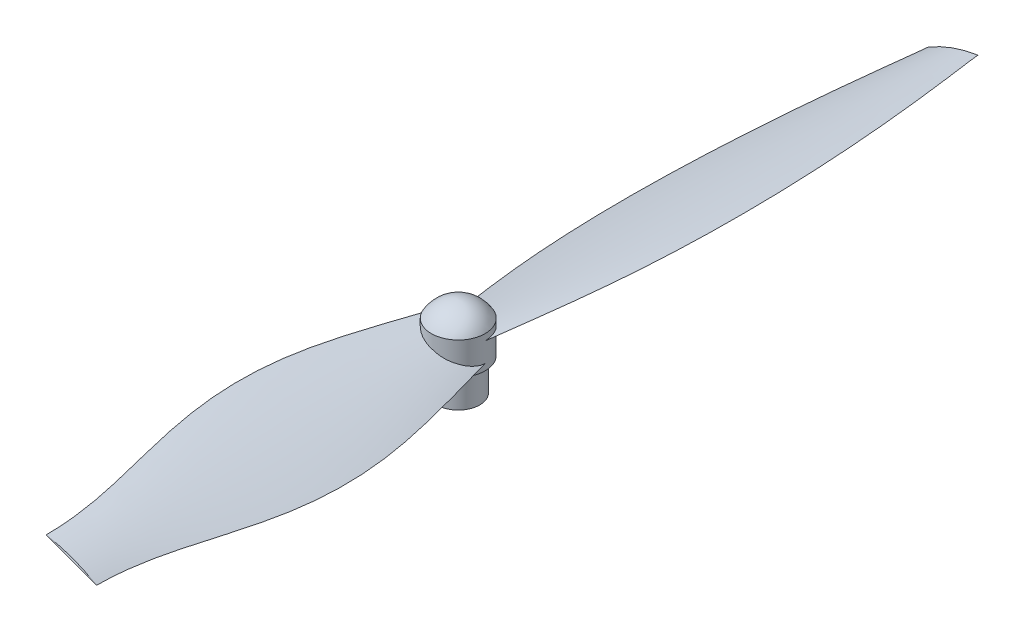
ISO-10303-21;
HEADER;
FILE_DESCRIPTION(('STEP AP214'),'2;1');
FILE_NAME('part.step','',(''),(''),'','','');
FILE_SCHEMA(('AUTOMOTIVE_DESIGN { 1 0 10303 214 1 1 1 1 }'));
ENDSEC;
DATA;
#1=APPLICATION_CONTEXT('core data for automotive mechanical design processes');
#2=APPLICATION_PROTOCOL_DEFINITION('international standard','automotive_design',2000,#1);
#3=PRODUCT_CONTEXT('',#1,'mechanical');
#4=PRODUCT('Part','Part','',(#3));
#5=PRODUCT_RELATED_PRODUCT_CATEGORY('part','',(#4));
#6=PRODUCT_DEFINITION_FORMATION('','',#4);
#7=PRODUCT_DEFINITION_CONTEXT('part definition',#1,'design');
#8=PRODUCT_DEFINITION('design','',#6,#7);
#9=PRODUCT_DEFINITION_SHAPE('','',#8);
#10=(LENGTH_UNIT() NAMED_UNIT(*) SI_UNIT(.MILLI.,.METRE.));
#11=(NAMED_UNIT(*) PLANE_ANGLE_UNIT() SI_UNIT($,.RADIAN.));
#12=(NAMED_UNIT(*) SI_UNIT($,.STERADIAN.) SOLID_ANGLE_UNIT());
#13=UNCERTAINTY_MEASURE_WITH_UNIT(LENGTH_MEASURE(1.E-05),#10,'distance_accuracy_value','');
#14=(GEOMETRIC_REPRESENTATION_CONTEXT(3) GLOBAL_UNCERTAINTY_ASSIGNED_CONTEXT((#13)) GLOBAL_UNIT_ASSIGNED_CONTEXT((#10,
#11,#12)) REPRESENTATION_CONTEXT('',''));
#15=CARTESIAN_POINT('',(0.,0.,0.));
#16=DIRECTION('',(0.,0.,1.));
#17=DIRECTION('',(1.,0.,0.));
#18=AXIS2_PLACEMENT_3D('',#15,#16,#17);
#19=CARTESIAN_POINT('',(-5.,7.18014882866901,0.));
#20=CARTESIAN_POINT('',(-5.,7.18014882866901,-0.681599091436951));
#21=CARTESIAN_POINT('',(-16.7309640210177,2.91042710577081,-44.6583309091122));
#22=CARTESIAN_POINT('',(-4.69846310392955,7.28989928337167,-89.5951543312805));
#23=CARTESIAN_POINT('',(-4.69846310392955,7.28989928337167,-92.));
#24=CARTESIAN_POINT('',(-1.96659598404994,9.09694074113013,0.));
#25=CARTESIAN_POINT('',(-1.96659598404994,9.09694074113013,-0.681599091436951));
#26=CARTESIAN_POINT('',(-5.83586544031535,7.71289175396942,-44.6583309091122));
#27=CARTESIAN_POINT('',(-1.82850177394058,9.05116134838689,-89.5951543312805));
#28=CARTESIAN_POINT('',(-1.82850177394058,9.05116134838689,-92.));
#29=CARTESIAN_POINT('',(1.44418761816929,10.3383644478612,0.));
#30=CARTESIAN_POINT('',(1.44418761816929,10.3383644478612,-0.68159909143695));
#31=CARTESIAN_POINT('',(5.29786952421744,11.7652398772682,-44.6583309091122));
#32=CARTESIAN_POINT('',(1.36782774232244,10.2145301512131,-89.5951543312805));
#33=CARTESIAN_POINT('',(1.36782774232244,10.2145301512131,-92.));
#34=CARTESIAN_POINT('',(5.,10.819851171331,0.));
#35=CARTESIAN_POINT('',(5.,10.819851171331,-0.68159909143695));
#36=CARTESIAN_POINT('',(16.7309640210177,15.0895728942291,-44.6583309091122));
#37=CARTESIAN_POINT('',(4.69846310392955,10.7101007166283,-89.5951543312805));
#38=CARTESIAN_POINT('',(4.69846310392955,10.7101007166283,-92.));
#39=B_SPLINE_SURFACE_WITH_KNOTS('',3,3,((#19,#20,#21,#22,#23),(#24,#25,#26,#27,#28),(#29,#30,
#31,#32,#33),(#34,#35,#36,#37,#38)),.UNSPECIFIED.,.F.,.F.,.F.,(4,4),(4,1,4),(0.,1.),(0.,
0.219119327033354,1.),.UNSPECIFIED.);
#40=CARTESIAN_POINT('',(-5.,7.18014882866901,0.));
#41=CARTESIAN_POINT('',(-1.96659598404994,9.09694074113013,0.));
#42=CARTESIAN_POINT('',(1.44418761816929,10.3383644478612,0.));
#43=CARTESIAN_POINT('',(5.,10.819851171331,0.));
#44=B_SPLINE_CURVE_WITH_KNOTS('',3,(#40,#41,#42,#43),.UNSPECIFIED.,.F.,.F.,(4,4),(0.,1.),.UNSPECIFIED.);
#45=CARTESIAN_POINT('',(-5.,7.18014882866901,0.));
#46=VERTEX_POINT('',#45);
#47=CARTESIAN_POINT('',(5.,10.819851171331,0.));
#48=VERTEX_POINT('',#47);
#49=EDGE_CURVE('E105',#46,#48,#44,.T.);
#50=CARTESIAN_POINT('',(5.,10.819851171331,0.));
#51=CARTESIAN_POINT('',(5.,10.819851171331,-0.68159909143695));
#52=CARTESIAN_POINT('',(16.7309640210177,15.0895728942291,-44.6583309091122));
#53=CARTESIAN_POINT('',(4.69846310392955,10.7101007166283,-89.5951543312805));
#54=CARTESIAN_POINT('',(4.69846310392955,10.7101007166283,-92.));
#55=B_SPLINE_CURVE_WITH_KNOTS('',3,(#50,#51,#52,#53,#54),.UNSPECIFIED.,.F.,.F.,(4,1,4),(0.,
0.219119327033354,1.),.UNSPECIFIED.);
#56=CARTESIAN_POINT('',(4.69846310392955,10.7101007166283,-92.));
#57=VERTEX_POINT('',#56);
#58=EDGE_CURVE('E104',#48,#57,#55,.T.);
#59=CARTESIAN_POINT('',(-4.69846310392955,7.28989928337167,-92.));
#60=CARTESIAN_POINT('',(-1.82850177394058,9.05116134838689,-92.));
#61=CARTESIAN_POINT('',(1.36782774232244,10.2145301512131,-92.));
#62=CARTESIAN_POINT('',(4.69846310392955,10.7101007166283,-92.));
#63=B_SPLINE_CURVE_WITH_KNOTS('',3,(#59,#60,#61,#62),.UNSPECIFIED.,.F.,.F.,(4,4),(0.,1.),.UNSPECIFIED.);
#64=CARTESIAN_POINT('',(-4.69846310392955,7.28989928337167,-92.));
#65=VERTEX_POINT('',#64);
#66=EDGE_CURVE('E91',#57,#65,#63,.F.);
#67=CARTESIAN_POINT('',(-5.,7.18014882866901,0.));
#68=CARTESIAN_POINT('',(-5.,7.18014882866901,-0.681599091436951));
#69=CARTESIAN_POINT('',(-16.7309640210177,2.91042710577081,-44.6583309091122));
#70=CARTESIAN_POINT('',(-4.69846310392955,7.28989928337167,-89.5951543312805));
#71=CARTESIAN_POINT('',(-4.69846310392955,7.28989928337167,-92.));
#72=B_SPLINE_CURVE_WITH_KNOTS('',3,(#67,#68,#69,#70,#71),.UNSPECIFIED.,.F.,.F.,(4,1,4),(0.,
0.219119327033354,1.),.UNSPECIFIED.);
#73=EDGE_CURVE('E103',#65,#46,#72,.F.);
#74=ORIENTED_EDGE('',*,*,#49,.T.);
#75=ORIENTED_EDGE('',*,*,#58,.T.);
#76=ORIENTED_EDGE('',*,*,#66,.T.);
#77=ORIENTED_EDGE('',*,*,#73,.T.);
#78=EDGE_LOOP('',(#74,#75,#76,#77));
#79=FACE_BOUND('',#78,.T.);
#80=ADVANCED_FACE('F76',(#79),#39,.T.);
#81=CARTESIAN_POINT('',(5.,10.819851171331,0.));
#82=DIRECTION('',(0.342020143325666,-0.939692620785909,0.));
#83=DIRECTION('',(-0.939692620785909,-0.342020143325666,0.));
#84=AXIS2_PLACEMENT_3D('',#81,#82,#83);
#85=PLANE('',#84);
#86=DIRECTION('',(-0.939692620785909,-0.342020143325666,0.));
#87=VECTOR('',#86,1.);
#88=CARTESIAN_POINT('',(0.,9.,0.));
#89=LINE('',#88,#87);
#90=EDGE_CURVE('E13',#48,#46,#89,.T.);
#91=ORIENTED_EDGE('',*,*,#90,.T.);
#92=ORIENTED_EDGE('',*,*,#73,.F.);
#93=DIRECTION('',(0.939692620785909,0.342020143325666,0.));
#94=VECTOR('',#93,1.);
#95=CARTESIAN_POINT('',(0.,9.,-92.));
#96=LINE('',#95,#94);
#97=EDGE_CURVE('E79',#65,#57,#96,.T.);
#98=ORIENTED_EDGE('',*,*,#97,.T.);
#99=ORIENTED_EDGE('',*,*,#58,.F.);
#100=EDGE_LOOP('',(#91,#92,#98,#99));
#101=FACE_BOUND('',#100,.T.);
#102=ADVANCED_FACE('F77',(#101),#85,.T.);
#103=OPEN_SHELL('',(#80,#102));
#104=SHELL_BASED_SURFACE_MODEL('B2',(#103));
#105=CARTESIAN_POINT('',(5.00000000000001,7.18014882866901,0.));
#106=CARTESIAN_POINT('',(5.00000000000001,7.18014882866901,0.681599091436951));
#107=CARTESIAN_POINT('',(14.9872215471169,3.5450974624965,38.1684985384249));
#108=CARTESIAN_POINT('',(4.69846310392955,7.28989928337168,54.5996346739401));
#109=CARTESIAN_POINT('',(4.69846310392955,7.28989928337168,72.));
#110=CARTESIAN_POINT('',(1.96659598404995,9.09694074113012,0.));
#111=CARTESIAN_POINT('',(1.96659598404995,9.09694074113012,0.68159909143695));
#112=CARTESIAN_POINT('',(5.26361434140243,7.92471716546496,38.1684985384249));
#113=CARTESIAN_POINT('',(1.82850177394058,9.05116134838689,54.5996346739401));
#114=CARTESIAN_POINT('',(1.82850177394058,9.05116134838689,72.));
#115=CARTESIAN_POINT('',(-1.44418761816929,10.3383644478612,0.));
#116=CARTESIAN_POINT('',(-1.44418761816929,10.3383644478612,0.68159909143695));
#117=CARTESIAN_POINT('',(-4.72334099990042,11.559671640645,38.1684985384249));
#118=CARTESIAN_POINT('',(-1.36782774232243,10.2145301512131,54.5996346739401));
#119=CARTESIAN_POINT('',(-1.36782774232243,10.2145301512131,72.));
#120=CARTESIAN_POINT('',(-5.,10.819851171331,0.));
#121=CARTESIAN_POINT('',(-5.,10.819851171331,0.68159909143695));
#122=CARTESIAN_POINT('',(-14.9872215471168,14.4549025375035,38.1684985384249));
#123=CARTESIAN_POINT('',(-4.69846310392954,10.7101007166283,54.5996346739401));
#124=CARTESIAN_POINT('',(-4.69846310392954,10.7101007166283,72.));
#125=B_SPLINE_SURFACE_WITH_KNOTS('',3,3,((#105,#106,#107,#108,#109),(#110,#111,#112,#113,#114),
(#115,#116,#117,#118,#119),(#120,#121,#122,#123,#124)),.UNSPECIFIED.,.F.,.F.,.F.,(4,4),(4,1,4),
(0.,1.),(0.,0.279628251466301,1.),.UNSPECIFIED.);
#126=CARTESIAN_POINT('',(5.00000000000001,7.18014882866901,0.));
#127=CARTESIAN_POINT('',(1.96659598404995,9.09694074113012,0.));
#128=CARTESIAN_POINT('',(-1.44418761816929,10.3383644478612,0.));
#129=CARTESIAN_POINT('',(-5.,10.819851171331,0.));
#130=B_SPLINE_CURVE_WITH_KNOTS('',3,(#126,#127,#128,#129),.UNSPECIFIED.,.F.,.F.,(4,4),(0.,1.),.UNSPECIFIED.);
#131=CARTESIAN_POINT('',(5.00000000000001,7.18014882866901,0.));
#132=VERTEX_POINT('',#131);
#133=CARTESIAN_POINT('',(-5.,10.819851171331,0.));
#134=VERTEX_POINT('',#133);
#135=EDGE_CURVE('E203',#132,#134,#130,.T.);
#136=CARTESIAN_POINT('',(-5.,10.819851171331,0.));
#137=CARTESIAN_POINT('',(-5.,10.819851171331,0.68159909143695));
#138=CARTESIAN_POINT('',(-14.9872215471168,14.4549025375035,38.1684985384249));
#139=CARTESIAN_POINT('',(-4.69846310392954,10.7101007166283,54.5996346739401));
#140=CARTESIAN_POINT('',(-4.69846310392954,10.7101007166283,72.));
#141=B_SPLINE_CURVE_WITH_KNOTS('',3,(#136,#137,#138,#139,#140),.UNSPECIFIED.,.F.,.F.,(4,1,4),
(0.,0.279628251466301,1.),.UNSPECIFIED.);
#142=CARTESIAN_POINT('',(-4.69846310392954,10.7101007166283,72.));
#143=VERTEX_POINT('',#142);
#144=EDGE_CURVE('E202',#134,#143,#141,.T.);
#145=CARTESIAN_POINT('',(4.69846310392955,7.28989928337168,72.));
#146=CARTESIAN_POINT('',(1.82850177394058,9.05116134838689,72.));
#147=CARTESIAN_POINT('',(-1.36782774232243,10.2145301512131,72.));
#148=CARTESIAN_POINT('',(-4.69846310392954,10.7101007166283,72.));
#149=B_SPLINE_CURVE_WITH_KNOTS('',3,(#145,#146,#147,#148),.UNSPECIFIED.,.F.,.F.,(4,4),(0.,1.),.UNSPECIFIED.);
#150=CARTESIAN_POINT('',(4.69846310392955,7.28989928337168,72.));
#151=VERTEX_POINT('',#150);
#152=EDGE_CURVE('E189',#143,#151,#149,.F.);
#153=CARTESIAN_POINT('',(5.00000000000001,7.18014882866901,0.));
#154=CARTESIAN_POINT('',(5.00000000000001,7.18014882866901,0.681599091436951));
#155=CARTESIAN_POINT('',(14.9872215471169,3.5450974624965,38.1684985384249));
#156=CARTESIAN_POINT('',(4.69846310392955,7.28989928337168,54.5996346739401));
#157=CARTESIAN_POINT('',(4.69846310392955,7.28989928337168,72.));
#158=B_SPLINE_CURVE_WITH_KNOTS('',3,(#153,#154,#155,#156,#157),.UNSPECIFIED.,.F.,.F.,(4,1,4),
(0.,0.279628251466301,1.),.UNSPECIFIED.);
#159=EDGE_CURVE('E201',#151,#132,#158,.F.);
#160=ORIENTED_EDGE('',*,*,#135,.T.);
#161=ORIENTED_EDGE('',*,*,#144,.T.);
#162=ORIENTED_EDGE('',*,*,#152,.T.);
#163=ORIENTED_EDGE('',*,*,#159,.T.);
#164=EDGE_LOOP('',(#160,#161,#162,#163));
#165=FACE_BOUND('',#164,.T.);
#166=ADVANCED_FACE('F174',(#165),#125,.T.);
#167=CARTESIAN_POINT('',(-5.,10.819851171331,0.));
#168=DIRECTION('',(-0.342020143325665,-0.93969262078591,0.));
#169=DIRECTION('',(0.93969262078591,-0.342020143325665,0.));
#170=AXIS2_PLACEMENT_3D('',#167,#168,#169);
#171=PLANE('',#170);
#172=DIRECTION('',(0.93969262078591,-0.342020143325665,0.));
#173=VECTOR('',#172,1.);
#174=CARTESIAN_POINT('',(0.,9.,0.));
#175=LINE('',#174,#173);
#176=EDGE_CURVE('E74',#134,#132,#175,.T.);
#177=ORIENTED_EDGE('',*,*,#176,.T.);
#178=ORIENTED_EDGE('',*,*,#159,.F.);
#179=DIRECTION('',(-0.93969262078591,0.342020143325665,0.));
#180=VECTOR('',#179,1.);
#181=CARTESIAN_POINT('',(0.,9.,72.));
#182=LINE('',#181,#180);
#183=EDGE_CURVE('E177',#151,#143,#182,.T.);
#184=ORIENTED_EDGE('',*,*,#183,.T.);
#185=ORIENTED_EDGE('',*,*,#144,.F.);
#186=EDGE_LOOP('',(#177,#178,#184,#185));
#187=FACE_BOUND('',#186,.T.);
#188=ADVANCED_FACE('F175',(#187),#171,.T.);
#189=OPEN_SHELL('',(#166,#188));
#190=SHELL_BASED_SURFACE_MODEL('B7',(#189));
#191=CARTESIAN_POINT('',(0.,0.,0.));
#192=DIRECTION('',(0.,-1.,0.));
#193=DIRECTION('',(0.,0.,-1.));
#194=AXIS2_PLACEMENT_3D('',#191,#192,#193);
#195=PLANE('',#194);
#196=DIRECTION('',(0.999412460106029,0.,0.0342744013049825));
#197=VECTOR('',#196,1.);
#198=CARTESIAN_POINT('',(-1.35684162892175,0.,-2.54800198731443));
#199=LINE('',#198,#197);
#200=CARTESIAN_POINT('',(-1.35684162892175,0.,-2.54800198731443));
#201=VERTEX_POINT('',#200);
#202=CARTESIAN_POINT('',(1.52821363544666,0.,-2.44906031321571));
#203=VERTEX_POINT('',#202);
#204=EDGE_CURVE('E277',#201,#203,#199,.T.);
#205=ORIENTED_EDGE('',*,*,#204,.F.);
#206=DIRECTION('',(0.529388732282632,0.,-0.848379378658032));
#207=VECTOR('',#206,1.);
#208=CARTESIAN_POINT('',(-2.88505526436841,0.,-0.0989416740987238));
#209=LINE('',#208,#207);
#210=CARTESIAN_POINT('',(-2.88505526436841,0.,-0.0989416740987238));
#211=VERTEX_POINT('',#210);
#212=EDGE_CURVE('E339',#211,#201,#209,.T.);
#213=ORIENTED_EDGE('',*,*,#212,.F.);
#214=DIRECTION('',(-0.470023727823397,0.,-0.882653779963014));
#215=VECTOR('',#214,1.);
#216=CARTESIAN_POINT('',(-1.52821363544666,0.,2.44906031321571));
#217=LINE('',#216,#215);
#218=CARTESIAN_POINT('',(-1.52821363544666,0.,2.44906031321571));
#219=VERTEX_POINT('',#218);
#220=EDGE_CURVE('E343',#219,#211,#217,.T.);
#221=ORIENTED_EDGE('',*,*,#220,.F.);
#222=DIRECTION('',(-0.999412460106029,0.,-0.0342744013049824));
#223=VECTOR('',#222,1.);
#224=CARTESIAN_POINT('',(1.35684162892175,0.,2.54800198731444));
#225=LINE('',#224,#223);
#226=CARTESIAN_POINT('',(1.35684162892175,0.,2.54800198731444));
#227=VERTEX_POINT('',#226);
#228=EDGE_CURVE('E366',#227,#219,#225,.T.);
#229=ORIENTED_EDGE('',*,*,#228,.F.);
#230=DIRECTION('',(-0.529388732282632,0.,0.848379378658032));
#231=VECTOR('',#230,1.);
#232=CARTESIAN_POINT('',(2.88505526436841,0.,0.098941674098725));
#233=LINE('',#232,#231);
#234=CARTESIAN_POINT('',(2.88505526436841,0.,0.098941674098725));
#235=VERTEX_POINT('',#234);
#236=EDGE_CURVE('E362',#235,#227,#233,.T.);
#237=ORIENTED_EDGE('',*,*,#236,.F.);
#238=DIRECTION('',(0.470023727823397,0.,0.882653779963014));
#239=VECTOR('',#238,1.);
#240=CARTESIAN_POINT('',(1.52821363544666,0.,-2.44906031321571));
#241=LINE('',#240,#239);
#242=EDGE_CURVE('E359',#203,#235,#241,.T.);
#243=ORIENTED_EDGE('',*,*,#242,.F.);
#244=EDGE_LOOP('',(#205,#213,#221,#229,#237,#243));
#245=FACE_BOUND('',#244,.T.);
#246=CARTESIAN_POINT('',(0.,0.,0.));
#247=DIRECTION('',(0.,-1.,0.));
#248=DIRECTION('',(0.,0.,-1.));
#249=AXIS2_PLACEMENT_3D('',#246,#247,#248);
#250=CIRCLE('',#249,4.);
#251=CARTESIAN_POINT('',(0.,0.,-4.));
#252=VERTEX_POINT('',#251);
#253=EDGE_CURVE('E376',#252,#252,#250,.T.);
#254=ORIENTED_EDGE('',*,*,#253,.T.);
#255=EDGE_LOOP('',(#254));
#256=FACE_BOUND('',#255,.T.);
#257=ADVANCED_FACE('F262',(#245,#256),#195,.T.);
#258=CARTESIAN_POINT('',(0.,9.00326916134687,0.19803850319188));
#259=DIRECTION('',(-1.,0.,0.));
#260=DIRECTION('',(0.,0.,-1.));
#261=AXIS2_PLACEMENT_3D('',#258,#259,#260);
#262=CIRCLE('',#261,6.);
#263=TRIMMED_CURVE('',#262,(PARAMETER_VALUE(-1.53778391366149)),
(PARAMETER_VALUE(1.53778391366149)),.T.,.PARAMETER.);
#264=CARTESIAN_POINT('',(0.,9.00326916134687,0.));
#265=DIRECTION('',(0.,-1.,0.));
#266=AXIS1_PLACEMENT('',#264,#265);
#267=SURFACE_OF_REVOLUTION('',#263,#266);
#268=CARTESIAN_POINT('',(0.,15.,0.));
#269=VERTEX_POINT('',#268);
#270=VERTEX_LOOP('',#269);
#271=FACE_BOUND('',#270,.T.);
#272=CARTESIAN_POINT('',(0.,12.,0.));
#273=DIRECTION('',(0.,-1.,0.));
#274=DIRECTION('',(0.,0.,-1.));
#275=AXIS2_PLACEMENT_3D('',#272,#273,#274);
#276=CIRCLE('',#275,5.);
#277=CARTESIAN_POINT('',(0.,12.,-5.));
#278=VERTEX_POINT('',#277);
#279=EDGE_CURVE('E172',#278,#278,#276,.T.);
#280=ORIENTED_EDGE('',*,*,#279,.F.);
#281=EDGE_LOOP('',(#280));
#282=FACE_BOUND('',#281,.T.);
#283=ADVANCED_FACE('F403',(#271,#282),#267,.T.);
#284=CARTESIAN_POINT('',(0.,0.,0.));
#285=DIRECTION('',(0.,-1.,0.));
#286=DIRECTION('',(0.,0.,-1.));
#287=AXIS2_PLACEMENT_3D('',#284,#285,#286);
#288=CYLINDRICAL_SURFACE('',#287,5.);
#289=ORIENTED_EDGE('',*,*,#279,.T.);
#290=EDGE_LOOP('',(#289));
#291=FACE_BOUND('',#290,.T.);
#292=CARTESIAN_POINT('',(0.,6.,0.));
#293=DIRECTION('',(0.,-1.,0.));
#294=DIRECTION('',(0.,0.,-1.));
#295=AXIS2_PLACEMENT_3D('',#292,#293,#294);
#296=CIRCLE('',#295,5.);
#297=CARTESIAN_POINT('',(0.,6.,-5.));
#298=VERTEX_POINT('',#297);
#299=EDGE_CURVE('E270',#298,#298,#296,.T.);
#300=ORIENTED_EDGE('',*,*,#299,.F.);
#301=EDGE_LOOP('',(#300));
#302=FACE_BOUND('',#301,.T.);
#303=ADVANCED_FACE('F401',(#291,#302),#288,.T.);
#304=CARTESIAN_POINT('',(4.,6.,0.));
#305=DIRECTION('',(0.,-1.,0.));
#306=DIRECTION('',(0.,0.,-1.));
#307=AXIS2_PLACEMENT_3D('',#304,#305,#306);
#308=PLANE('',#307);
#309=ORIENTED_EDGE('',*,*,#299,.T.);
#310=EDGE_LOOP('',(#309));
#311=FACE_BOUND('',#310,.T.);
#312=CARTESIAN_POINT('',(0.,6.,0.));
#313=DIRECTION('',(0.,-1.,0.));
#314=DIRECTION('',(0.,0.,-1.));
#315=AXIS2_PLACEMENT_3D('',#312,#313,#314);
#316=CIRCLE('',#315,4.);
#317=CARTESIAN_POINT('',(0.,6.,-4.));
#318=VERTEX_POINT('',#317);
#319=EDGE_CURVE('E391',#318,#318,#316,.T.);
#320=ORIENTED_EDGE('',*,*,#319,.F.);
#321=EDGE_LOOP('',(#320));
#322=FACE_BOUND('',#321,.T.);
#323=ADVANCED_FACE('F398',(#311,#322),#308,.T.);
#324=CARTESIAN_POINT('',(0.,0.,0.));
#325=DIRECTION('',(0.,-1.,0.));
#326=DIRECTION('',(0.,0.,-1.));
#327=AXIS2_PLACEMENT_3D('',#324,#325,#326);
#328=CYLINDRICAL_SURFACE('',#327,4.);
#329=ORIENTED_EDGE('',*,*,#319,.T.);
#330=EDGE_LOOP('',(#329));
#331=FACE_BOUND('',#330,.T.);
#332=ORIENTED_EDGE('',*,*,#253,.F.);
#333=EDGE_LOOP('',(#332));
#334=FACE_BOUND('',#333,.T.);
#335=ADVANCED_FACE('F410',(#331,#334),#328,.T.);
#336=CARTESIAN_POINT('',(-1.35684162892175,7.,-2.54800198731443));
#337=DIRECTION('',(0.0342744013049825,0.,-0.999412460106029));
#338=DIRECTION('',(-0.999412460106029,0.,-0.0342744013049825));
#339=AXIS2_PLACEMENT_3D('',#336,#337,#338);
#340=PLANE('',#339);
#341=ORIENTED_EDGE('',*,*,#204,.T.);
#342=DIRECTION('',(0.,-1.,0.));
#343=VECTOR('',#342,1.);
#344=CARTESIAN_POINT('',(1.52821363544666,7.,-2.44906031321571));
#345=LINE('',#344,#343);
#346=CARTESIAN_POINT('',(1.52821363544666,7.,-2.44906031321571));
#347=VERTEX_POINT('',#346);
#348=EDGE_CURVE('E313',#347,#203,#345,.T.);
#349=ORIENTED_EDGE('',*,*,#348,.F.);
#350=DIRECTION('',(0.999412460106029,0.,0.0342744013049825));
#351=VECTOR('',#350,1.);
#352=CARTESIAN_POINT('',(-1.35684162892175,7.,-2.54800198731443));
#353=LINE('',#352,#351);
#354=CARTESIAN_POINT('',(-1.35684162892175,7.,-2.54800198731443));
#355=VERTEX_POINT('',#354);
#356=EDGE_CURVE('E317',#355,#347,#353,.T.);
#357=ORIENTED_EDGE('',*,*,#356,.F.);
#358=DIRECTION('',(0.,-1.,0.));
#359=VECTOR('',#358,1.);
#360=CARTESIAN_POINT('',(-1.35684162892175,7.,-2.54800198731443));
#361=LINE('',#360,#359);
#362=EDGE_CURVE('E373',#355,#201,#361,.T.);
#363=ORIENTED_EDGE('',*,*,#362,.T.);
#364=EDGE_LOOP('',(#341,#349,#357,#363));
#365=FACE_BOUND('',#364,.T.);
#366=ADVANCED_FACE('F315',(#365),#340,.F.);
#367=CARTESIAN_POINT('',(-2.88505526436841,7.,-0.0989416740987238));
#368=DIRECTION('',(-0.848379378658032,0.,-0.529388732282632));
#369=DIRECTION('',(-0.529388732282632,0.,0.848379378658032));
#370=AXIS2_PLACEMENT_3D('',#367,#368,#369);
#371=PLANE('',#370);
#372=ORIENTED_EDGE('',*,*,#212,.T.);
#373=ORIENTED_EDGE('',*,*,#362,.F.);
#374=DIRECTION('',(0.529388732282632,0.,-0.848379378658032));
#375=VECTOR('',#374,1.);
#376=CARTESIAN_POINT('',(-2.88505526436841,7.,-0.0989416740987238));
#377=LINE('',#376,#375);
#378=CARTESIAN_POINT('',(-2.88505526436841,7.,-0.0989416740987238));
#379=VERTEX_POINT('',#378);
#380=EDGE_CURVE('E324',#379,#355,#377,.T.);
#381=ORIENTED_EDGE('',*,*,#380,.F.);
#382=DIRECTION('',(0.,-1.,0.));
#383=VECTOR('',#382,1.);
#384=CARTESIAN_POINT('',(-2.88505526436841,7.,-0.0989416740987238));
#385=LINE('',#384,#383);
#386=EDGE_CURVE('E377',#379,#211,#385,.T.);
#387=ORIENTED_EDGE('',*,*,#386,.T.);
#388=EDGE_LOOP('',(#372,#373,#381,#387));
#389=FACE_BOUND('',#388,.T.);
#390=ADVANCED_FACE('F426',(#389),#371,.F.);
#391=CARTESIAN_POINT('',(-1.52821363544666,7.,2.44906031321571));
#392=DIRECTION('',(-0.882653779963014,0.,0.470023727823398));
#393=DIRECTION('',(0.470023727823398,0.,0.882653779963014));
#394=AXIS2_PLACEMENT_3D('',#391,#392,#393);
#395=PLANE('',#394);
#396=ORIENTED_EDGE('',*,*,#220,.T.);
#397=ORIENTED_EDGE('',*,*,#386,.F.);
#398=DIRECTION('',(-0.470023727823397,0.,-0.882653779963014));
#399=VECTOR('',#398,1.);
#400=CARTESIAN_POINT('',(-1.52821363544666,7.,2.44906031321571));
#401=LINE('',#400,#399);
#402=CARTESIAN_POINT('',(-1.52821363544666,7.,2.44906031321571));
#403=VERTEX_POINT('',#402);
#404=EDGE_CURVE('E352',#403,#379,#401,.T.);
#405=ORIENTED_EDGE('',*,*,#404,.F.);
#406=DIRECTION('',(0.,-1.,0.));
#407=VECTOR('',#406,1.);
#408=CARTESIAN_POINT('',(-1.52821363544666,7.,2.44906031321571));
#409=LINE('',#408,#407);
#410=EDGE_CURVE('E380',#403,#219,#409,.T.);
#411=ORIENTED_EDGE('',*,*,#410,.T.);
#412=EDGE_LOOP('',(#396,#397,#405,#411));
#413=FACE_BOUND('',#412,.T.);
#414=ADVANCED_FACE('F438',(#413),#395,.F.);
#415=CARTESIAN_POINT('',(1.35684162892175,7.,2.54800198731444));
#416=DIRECTION('',(-0.0342744013049824,0.,0.999412460106029));
#417=DIRECTION('',(0.999412460106029,0.,0.0342744013049824));
#418=AXIS2_PLACEMENT_3D('',#415,#416,#417);
#419=PLANE('',#418);
#420=ORIENTED_EDGE('',*,*,#228,.T.);
#421=ORIENTED_EDGE('',*,*,#410,.F.);
#422=DIRECTION('',(-0.999412460106029,0.,-0.0342744013049824));
#423=VECTOR('',#422,1.);
#424=CARTESIAN_POINT('',(1.35684162892175,7.,2.54800198731444));
#425=LINE('',#424,#423);
#426=CARTESIAN_POINT('',(1.35684162892175,7.,2.54800198731444));
#427=VERTEX_POINT('',#426);
#428=EDGE_CURVE('E348',#427,#403,#425,.T.);
#429=ORIENTED_EDGE('',*,*,#428,.F.);
#430=DIRECTION('',(0.,-1.,0.));
#431=VECTOR('',#430,1.);
#432=CARTESIAN_POINT('',(1.35684162892175,7.,2.54800198731444));
#433=LINE('',#432,#431);
#434=EDGE_CURVE('E383',#427,#227,#433,.T.);
#435=ORIENTED_EDGE('',*,*,#434,.T.);
#436=EDGE_LOOP('',(#420,#421,#429,#435));
#437=FACE_BOUND('',#436,.T.);
#438=ADVANCED_FACE('F434',(#437),#419,.F.);
#439=CARTESIAN_POINT('',(2.88505526436841,7.,0.098941674098725));
#440=DIRECTION('',(0.848379378658032,0.,0.529388732282632));
#441=DIRECTION('',(0.529388732282632,0.,-0.848379378658032));
#442=AXIS2_PLACEMENT_3D('',#439,#440,#441);
#443=PLANE('',#442);
#444=ORIENTED_EDGE('',*,*,#236,.T.);
#445=ORIENTED_EDGE('',*,*,#434,.F.);
#446=DIRECTION('',(-0.529388732282632,0.,0.848379378658032));
#447=VECTOR('',#446,1.);
#448=CARTESIAN_POINT('',(2.88505526436841,7.,0.098941674098725));
#449=LINE('',#448,#447);
#450=CARTESIAN_POINT('',(2.88505526436841,7.,0.098941674098725));
#451=VERTEX_POINT('',#450);
#452=EDGE_CURVE('E333',#451,#427,#449,.T.);
#453=ORIENTED_EDGE('',*,*,#452,.F.);
#454=DIRECTION('',(0.,-1.,0.));
#455=VECTOR('',#454,1.);
#456=CARTESIAN_POINT('',(2.88505526436841,7.,0.098941674098725));
#457=LINE('',#456,#455);
#458=EDGE_CURVE('E323',#451,#235,#457,.T.);
#459=ORIENTED_EDGE('',*,*,#458,.T.);
#460=EDGE_LOOP('',(#444,#445,#453,#459));
#461=FACE_BOUND('',#460,.T.);
#462=ADVANCED_FACE('F431',(#461),#443,.F.);
#463=CARTESIAN_POINT('',(1.52821363544666,7.,-2.44906031321571));
#464=DIRECTION('',(0.882653779963014,0.,-0.470023727823397));
#465=DIRECTION('',(-0.470023727823397,0.,-0.882653779963014));
#466=AXIS2_PLACEMENT_3D('',#463,#464,#465);
#467=PLANE('',#466);
#468=ORIENTED_EDGE('',*,*,#242,.T.);
#469=ORIENTED_EDGE('',*,*,#458,.F.);
#470=DIRECTION('',(0.470023727823397,0.,0.882653779963014));
#471=VECTOR('',#470,1.);
#472=CARTESIAN_POINT('',(1.52821363544666,7.,-2.44906031321571));
#473=LINE('',#472,#471);
#474=EDGE_CURVE('E327',#347,#451,#473,.T.);
#475=ORIENTED_EDGE('',*,*,#474,.F.);
#476=ORIENTED_EDGE('',*,*,#348,.T.);
#477=EDGE_LOOP('',(#468,#469,#475,#476));
#478=FACE_BOUND('',#477,.T.);
#479=ADVANCED_FACE('F328',(#478),#467,.F.);
#480=CARTESIAN_POINT('',(0.,7.,0.));
#481=DIRECTION('',(0.,-1.,0.));
#482=DIRECTION('',(0.,0.,-1.));
#483=AXIS2_PLACEMENT_3D('',#480,#481,#482);
#484=PLANE('',#483);
#485=ORIENTED_EDGE('',*,*,#356,.T.);
#486=ORIENTED_EDGE('',*,*,#474,.T.);
#487=ORIENTED_EDGE('',*,*,#452,.T.);
#488=ORIENTED_EDGE('',*,*,#428,.T.);
#489=ORIENTED_EDGE('',*,*,#404,.T.);
#490=ORIENTED_EDGE('',*,*,#380,.T.);
#491=EDGE_LOOP('',(#485,#486,#487,#488,#489,#490));
#492=FACE_BOUND('',#491,.T.);
#493=ADVANCED_FACE('F335',(#492),#484,.T.);
#494=CLOSED_SHELL('',(#257,#283,#303,#323,#335,#366,#390,#414,#438,#462,#479,#493));
#495=MANIFOLD_SOLID_BREP('B68',#494);
#496=ADVANCED_BREP_SHAPE_REPRESENTATION('',(#18,#495),#14);
#497=MANIFOLD_SURFACE_SHAPE_REPRESENTATION('',(#18,#104,#190),#14);
#498=SHAPE_REPRESENTATION('',(#18),#14);
#499=SHAPE_DEFINITION_REPRESENTATION(#9,#498);
#500=SHAPE_REPRESENTATION_RELATIONSHIP('','',#498,#496);
#501=SHAPE_REPRESENTATION_RELATIONSHIP('','',#498,#497);
ENDSEC;
END-ISO-10303-21;
